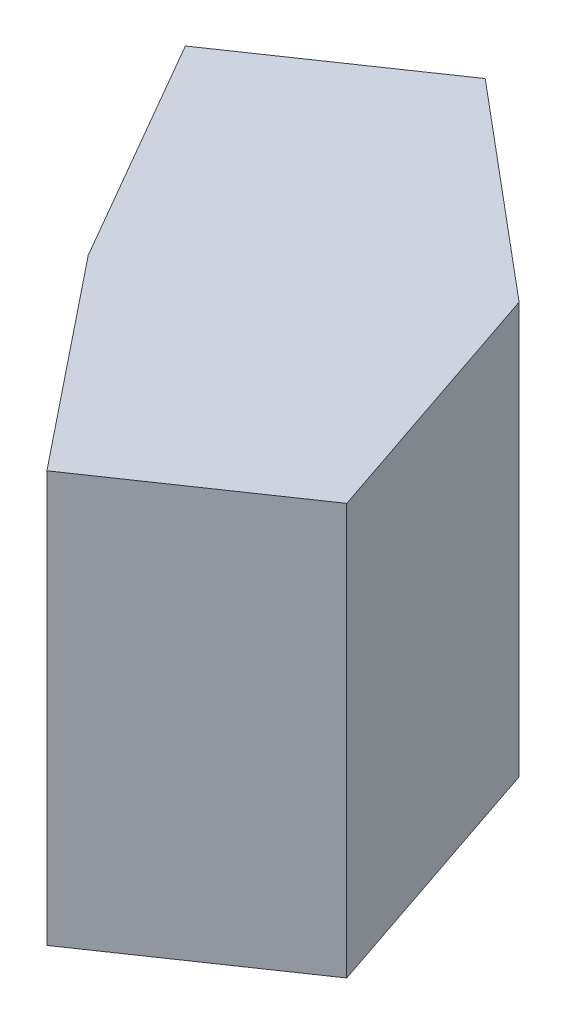
ISO-10303-21;
HEADER;
FILE_DESCRIPTION(('STEP AP214'),'2;1');
FILE_NAME('part.step','',(''),(''),'','','');
FILE_SCHEMA(('AUTOMOTIVE_DESIGN { 1 0 10303 214 1 1 1 1 }'));
ENDSEC;
DATA;
#1=APPLICATION_CONTEXT('core data for automotive mechanical design processes');
#2=APPLICATION_PROTOCOL_DEFINITION('international standard','automotive_design',2000,#1);
#3=PRODUCT_CONTEXT('',#1,'mechanical');
#4=PRODUCT('Part','Part','',(#3));
#5=PRODUCT_RELATED_PRODUCT_CATEGORY('part','',(#4));
#6=PRODUCT_DEFINITION_FORMATION('','',#4);
#7=PRODUCT_DEFINITION_CONTEXT('part definition',#1,'design');
#8=PRODUCT_DEFINITION('design','',#6,#7);
#9=PRODUCT_DEFINITION_SHAPE('','',#8);
#10=(LENGTH_UNIT() NAMED_UNIT(*) SI_UNIT(.MILLI.,.METRE.));
#11=(NAMED_UNIT(*) PLANE_ANGLE_UNIT() SI_UNIT($,.RADIAN.));
#12=(NAMED_UNIT(*) SI_UNIT($,.STERADIAN.) SOLID_ANGLE_UNIT());
#13=UNCERTAINTY_MEASURE_WITH_UNIT(LENGTH_MEASURE(1.E-05),#10,'distance_accuracy_value','');
#14=(GEOMETRIC_REPRESENTATION_CONTEXT(3) GLOBAL_UNCERTAINTY_ASSIGNED_CONTEXT((#13)) GLOBAL_UNIT_ASSIGNED_CONTEXT((#10,
#11,#12)) REPRESENTATION_CONTEXT('',''));
#15=CARTESIAN_POINT('',(0.,0.,0.));
#16=DIRECTION('',(0.,0.,1.));
#17=DIRECTION('',(1.,0.,0.));
#18=AXIS2_PLACEMENT_3D('',#15,#16,#17);
#19=CARTESIAN_POINT('',(13.8030904878114,6.5,23.90765402636));
#20=DIRECTION('',(0.866025403784439,0.,-0.5));
#21=DIRECTION('',(-0.5,0.,-0.866025403784439));
#22=AXIS2_PLACEMENT_3D('',#19,#20,#21);
#23=PLANE('',#22);
#24=DIRECTION('',(0.5,0.,0.866025403784439));
#25=VECTOR('',#24,1.);
#26=CARTESIAN_POINT('',(13.8030904878114,-6.5,23.90765402636));
#27=LINE('',#26,#25);
#28=CARTESIAN_POINT('',(9.60527189066714,-6.5,16.6368189351487));
#29=VERTEX_POINT('',#28);
#30=CARTESIAN_POINT('',(13.8030904878114,-6.5,23.90765402636));
#31=VERTEX_POINT('',#30);
#32=EDGE_CURVE('E134',#29,#31,#27,.T.);
#33=ORIENTED_EDGE('',*,*,#32,.T.);
#34=DIRECTION('',(0.,-1.,0.));
#35=VECTOR('',#34,1.);
#36=CARTESIAN_POINT('',(13.8030904878114,6.5,23.90765402636));
#37=LINE('',#36,#35);
#38=CARTESIAN_POINT('',(13.8030904878114,6.5,23.90765402636));
#39=VERTEX_POINT('',#38);
#40=EDGE_CURVE('E131',#39,#31,#37,.T.);
#41=ORIENTED_EDGE('',*,*,#40,.F.);
#42=DIRECTION('',(0.5,0.,0.866025403784439));
#43=VECTOR('',#42,1.);
#44=CARTESIAN_POINT('',(13.8030904878114,6.5,23.90765402636));
#45=LINE('',#44,#43);
#46=CARTESIAN_POINT('',(9.60527189066714,6.5,16.6368189351487));
#47=VERTEX_POINT('',#46);
#48=EDGE_CURVE('E79',#47,#39,#45,.T.);
#49=ORIENTED_EDGE('',*,*,#48,.F.);
#50=DIRECTION('',(0.,-1.,0.));
#51=VECTOR('',#50,1.);
#52=CARTESIAN_POINT('',(9.60527189066714,6.5,16.6368189351487));
#53=LINE('',#52,#51);
#54=EDGE_CURVE('E47',#47,#29,#53,.T.);
#55=ORIENTED_EDGE('',*,*,#54,.T.);
#56=EDGE_LOOP('',(#33,#41,#49,#55));
#57=FACE_BOUND('',#56,.T.);
#58=ADVANCED_FACE('F39',(#57),#23,.F.);
#59=CARTESIAN_POINT('',(15.238834477124,6.5,12.7869003893264));
#60=DIRECTION('',(-0.64278760968654,0.,0.766044443118977));
#61=DIRECTION('',(0.766044443118977,0.,0.64278760968654));
#62=AXIS2_PLACEMENT_3D('',#59,#60,#61);
#63=PLANE('',#62);
#64=DIRECTION('',(-0.766044443118977,0.,-0.64278760968654));
#65=VECTOR('',#64,1.);
#66=CARTESIAN_POINT('',(15.238834477124,-6.5,12.7869003893264));
#67=LINE('',#66,#65);
#68=CARTESIAN_POINT('',(21.8993873841182,-6.5,18.375767877022));
#69=VERTEX_POINT('',#68);
#70=CARTESIAN_POINT('',(15.238834477124,-6.5,12.7869003893264));
#71=VERTEX_POINT('',#70);
#72=EDGE_CURVE('E69',#69,#71,#67,.T.);
#73=ORIENTED_EDGE('',*,*,#72,.T.);
#74=DIRECTION('',(0.,-1.,0.));
#75=VECTOR('',#74,1.);
#76=CARTESIAN_POINT('',(15.238834477124,6.5,12.7869003893264));
#77=LINE('',#76,#75);
#78=CARTESIAN_POINT('',(15.238834477124,6.5,12.7869003893264));
#79=VERTEX_POINT('',#78);
#80=EDGE_CURVE('E11',#79,#71,#77,.T.);
#81=ORIENTED_EDGE('',*,*,#80,.F.);
#82=DIRECTION('',(-0.766044443118977,0.,-0.64278760968654));
#83=VECTOR('',#82,1.);
#84=CARTESIAN_POINT('',(15.238834477124,6.5,12.7869003893264));
#85=LINE('',#84,#83);
#86=CARTESIAN_POINT('',(21.8993873841182,6.5,18.375767877022));
#87=VERTEX_POINT('',#86);
#88=EDGE_CURVE('E136',#87,#79,#85,.T.);
#89=ORIENTED_EDGE('',*,*,#88,.F.);
#90=DIRECTION('',(0.,-1.,0.));
#91=VECTOR('',#90,1.);
#92=CARTESIAN_POINT('',(21.8993873841182,6.5,18.375767877022));
#93=LINE('',#92,#91);
#94=EDGE_CURVE('E117',#87,#69,#93,.T.);
#95=ORIENTED_EDGE('',*,*,#94,.T.);
#96=EDGE_LOOP('',(#73,#81,#89,#95));
#97=FACE_BOUND('',#96,.T.);
#98=ADVANCED_FACE('F159',(#97),#63,.F.);
#99=CARTESIAN_POINT('',(9.60527189066714,6.5,16.6368189351487));
#100=DIRECTION('',(0.564222218795617,0.,0.8256229695311));
#101=DIRECTION('',(0.8256229695311,0.,-0.564222218795617));
#102=AXIS2_PLACEMENT_3D('',#99,#100,#101);
#103=PLANE('',#102);
#104=DIRECTION('',(-0.8256229695311,0.,0.564222218795617));
#105=VECTOR('',#104,1.);
#106=CARTESIAN_POINT('',(9.60527189066714,-6.5,16.6368189351487));
#107=LINE('',#106,#105);
#108=EDGE_CURVE('E74',#71,#29,#107,.T.);
#109=ORIENTED_EDGE('',*,*,#108,.T.);
#110=ORIENTED_EDGE('',*,*,#54,.F.);
#111=DIRECTION('',(-0.8256229695311,0.,0.564222218795617));
#112=VECTOR('',#111,1.);
#113=CARTESIAN_POINT('',(9.60527189066714,6.5,16.6368189351487));
#114=LINE('',#113,#112);
#115=EDGE_CURVE('E55',#79,#47,#114,.T.);
#116=ORIENTED_EDGE('',*,*,#115,.F.);
#117=ORIENTED_EDGE('',*,*,#80,.T.);
#118=EDGE_LOOP('',(#109,#110,#116,#117));
#119=FACE_BOUND('',#118,.T.);
#120=ADVANCED_FACE('F164',(#119),#103,.F.);
#121=CARTESIAN_POINT('',(0.,6.5,0.));
#122=DIRECTION('',(0.,1.,0.));
#123=DIRECTION('',(0.,0.,1.));
#124=AXIS2_PLACEMENT_3D('',#121,#122,#123);
#125=PLANE('',#124);
#126=ORIENTED_EDGE('',*,*,#48,.T.);
#127=DIRECTION('',(-0.625059650896254,0.,-0.780576987120075));
#128=VECTOR('',#127,1.);
#129=CARTESIAN_POINT('',(13.8030904878114,6.5,23.90765402636));
#130=LINE('',#129,#128);
#131=CARTESIAN_POINT('',(19.0508645415249,6.5,30.4610952124309));
#132=VERTEX_POINT('',#131);
#133=EDGE_CURVE('E104',#132,#39,#130,.T.);
#134=ORIENTED_EDGE('',*,*,#133,.F.);
#135=DIRECTION('',(-0.825721733769986,0.,0.564077670520549));
#136=VECTOR('',#135,1.);
#137=CARTESIAN_POINT('',(19.0508645415249,6.5,30.4610952124309));
#138=LINE('',#137,#136);
#139=CARTESIAN_POINT('',(24.6851010367047,6.5,26.6121629785021));
#140=VERTEX_POINT('',#139);
#141=EDGE_CURVE('E97',#140,#132,#138,.T.);
#142=ORIENTED_EDGE('',*,*,#141,.F.);
#143=DIRECTION('',(0.3203908884867,0.,0.94728542613866));
#144=VECTOR('',#143,1.);
#145=CARTESIAN_POINT('',(24.6851010367047,6.5,26.6121629785021));
#146=LINE('',#145,#144);
#147=EDGE_CURVE('E101',#87,#140,#146,.T.);
#148=ORIENTED_EDGE('',*,*,#147,.F.);
#149=ORIENTED_EDGE('',*,*,#88,.T.);
#150=ORIENTED_EDGE('',*,*,#115,.T.);
#151=EDGE_LOOP('',(#126,#134,#142,#148,#149,#150));
#152=FACE_BOUND('',#151,.T.);
#153=ADVANCED_FACE('F99',(#152),#125,.T.);
#154=CARTESIAN_POINT('',(0.,-6.5,0.));
#155=DIRECTION('',(0.,1.,0.));
#156=DIRECTION('',(0.,0.,1.));
#157=AXIS2_PLACEMENT_3D('',#154,#155,#156);
#158=PLANE('',#157);
#159=ORIENTED_EDGE('',*,*,#32,.F.);
#160=ORIENTED_EDGE('',*,*,#108,.F.);
#161=ORIENTED_EDGE('',*,*,#72,.F.);
#162=DIRECTION('',(0.3203908884867,0.,0.94728542613866));
#163=VECTOR('',#162,1.);
#164=CARTESIAN_POINT('',(24.6851010367047,-6.5,26.6121629785021));
#165=LINE('',#164,#163);
#166=CARTESIAN_POINT('',(24.6851010367047,-6.5,26.6121629785021));
#167=VERTEX_POINT('',#166);
#168=EDGE_CURVE('E126',#69,#167,#165,.T.);
#169=ORIENTED_EDGE('',*,*,#168,.T.);
#170=DIRECTION('',(-0.825721733769986,0.,0.564077670520549));
#171=VECTOR('',#170,1.);
#172=CARTESIAN_POINT('',(19.0508645415249,-6.5,30.4610952124309));
#173=LINE('',#172,#171);
#174=CARTESIAN_POINT('',(19.0508645415249,-6.5,30.4610952124309));
#175=VERTEX_POINT('',#174);
#176=EDGE_CURVE('E113',#167,#175,#173,.T.);
#177=ORIENTED_EDGE('',*,*,#176,.T.);
#178=DIRECTION('',(-0.625059650896254,0.,-0.780576987120075));
#179=VECTOR('',#178,1.);
#180=CARTESIAN_POINT('',(13.8030904878114,-6.5,23.90765402636));
#181=LINE('',#180,#179);
#182=EDGE_CURVE('E123',#175,#31,#181,.T.);
#183=ORIENTED_EDGE('',*,*,#182,.T.);
#184=EDGE_LOOP('',(#159,#160,#161,#169,#177,#183));
#185=FACE_BOUND('',#184,.T.);
#186=ADVANCED_FACE('F144',(#185),#158,.F.);
#187=CARTESIAN_POINT('',(13.8030904878114,6.5,23.90765402636));
#188=DIRECTION('',(0.780576987120075,0.,-0.625059650896254));
#189=DIRECTION('',(0.625059650896254,0.,0.780576987120075));
#190=AXIS2_PLACEMENT_3D('',#187,#188,#189);
#191=PLANE('',#190);
#192=ORIENTED_EDGE('',*,*,#182,.F.);
#193=DIRECTION('',(0.,-1.,0.));
#194=VECTOR('',#193,1.);
#195=CARTESIAN_POINT('',(19.0508645415249,6.5,30.4610952124309));
#196=LINE('',#195,#194);
#197=EDGE_CURVE('E108',#132,#175,#196,.T.);
#198=ORIENTED_EDGE('',*,*,#197,.F.);
#199=ORIENTED_EDGE('',*,*,#133,.T.);
#200=ORIENTED_EDGE('',*,*,#40,.T.);
#201=EDGE_LOOP('',(#192,#198,#199,#200));
#202=FACE_BOUND('',#201,.T.);
#203=ADVANCED_FACE('F147',(#202),#191,.F.);
#204=CARTESIAN_POINT('',(24.6851010367047,6.5,26.6121629785021));
#205=DIRECTION('',(-0.947285426138661,0.,0.3203908884867));
#206=DIRECTION('',(-0.3203908884867,0.,-0.94728542613866));
#207=AXIS2_PLACEMENT_3D('',#204,#205,#206);
#208=PLANE('',#207);
#209=ORIENTED_EDGE('',*,*,#168,.F.);
#210=ORIENTED_EDGE('',*,*,#94,.F.);
#211=ORIENTED_EDGE('',*,*,#147,.T.);
#212=DIRECTION('',(0.,-1.,0.));
#213=VECTOR('',#212,1.);
#214=CARTESIAN_POINT('',(24.6851010367047,6.5,26.6121629785021));
#215=LINE('',#214,#213);
#216=EDGE_CURVE('E111',#140,#167,#215,.T.);
#217=ORIENTED_EDGE('',*,*,#216,.T.);
#218=EDGE_LOOP('',(#209,#210,#211,#217));
#219=FACE_BOUND('',#218,.T.);
#220=ADVANCED_FACE('F119',(#219),#208,.F.);
#221=CARTESIAN_POINT('',(19.0508645415249,6.5,30.4610952124309));
#222=DIRECTION('',(-0.564077670520549,0.,-0.825721733769986));
#223=DIRECTION('',(0.825721733769986,0.,-0.564077670520549));
#224=AXIS2_PLACEMENT_3D('',#221,#222,#223);
#225=PLANE('',#224);
#226=ORIENTED_EDGE('',*,*,#176,.F.);
#227=ORIENTED_EDGE('',*,*,#216,.F.);
#228=ORIENTED_EDGE('',*,*,#141,.T.);
#229=ORIENTED_EDGE('',*,*,#197,.T.);
#230=EDGE_LOOP('',(#226,#227,#228,#229));
#231=FACE_BOUND('',#230,.T.);
#232=ADVANCED_FACE('F112',(#231),#225,.F.);
#233=CLOSED_SHELL('',(#58,#98,#120,#153,#186,#203,#220,#232));
#234=MANIFOLD_SOLID_BREP('B2',#233);
#235=ADVANCED_BREP_SHAPE_REPRESENTATION('',(#18,#234),#14);
#236=SHAPE_DEFINITION_REPRESENTATION(#9,#235);
ENDSEC;
END-ISO-10303-21;
